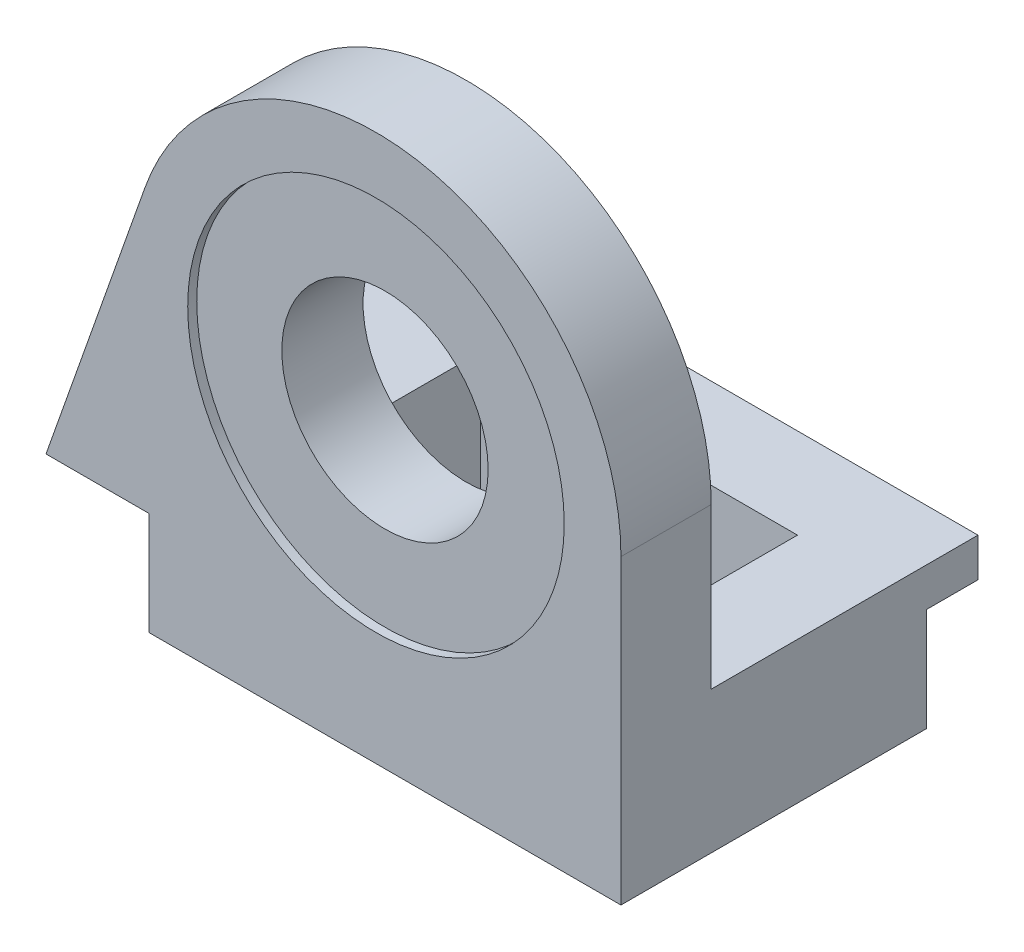
ISO-10303-21;
HEADER;
FILE_DESCRIPTION(('STEP AP214'),'2;1');
FILE_NAME('part.step','',(''),(''),'','','');
FILE_SCHEMA(('AUTOMOTIVE_DESIGN { 1 0 10303 214 1 1 1 1 }'));
ENDSEC;
DATA;
#1=APPLICATION_CONTEXT('core data for automotive mechanical design processes');
#2=APPLICATION_PROTOCOL_DEFINITION('international standard','automotive_design',2000,#1);
#3=PRODUCT_CONTEXT('',#1,'mechanical');
#4=PRODUCT('Part','Part','',(#3));
#5=PRODUCT_RELATED_PRODUCT_CATEGORY('part','',(#4));
#6=PRODUCT_DEFINITION_FORMATION('','',#4);
#7=PRODUCT_DEFINITION_CONTEXT('part definition',#1,'design');
#8=PRODUCT_DEFINITION('design','',#6,#7);
#9=PRODUCT_DEFINITION_SHAPE('','',#8);
#10=(LENGTH_UNIT() NAMED_UNIT(*) SI_UNIT(.MILLI.,.METRE.));
#11=(NAMED_UNIT(*) PLANE_ANGLE_UNIT() SI_UNIT($,.RADIAN.));
#12=(NAMED_UNIT(*) SI_UNIT($,.STERADIAN.) SOLID_ANGLE_UNIT());
#13=UNCERTAINTY_MEASURE_WITH_UNIT(LENGTH_MEASURE(1.E-05),#10,'distance_accuracy_value','');
#14=(GEOMETRIC_REPRESENTATION_CONTEXT(3) GLOBAL_UNCERTAINTY_ASSIGNED_CONTEXT((#13)) GLOBAL_UNIT_ASSIGNED_CONTEXT((#10,
#11,#12)) REPRESENTATION_CONTEXT('',''));
#15=CARTESIAN_POINT('',(0.,0.,0.));
#16=DIRECTION('',(0.,0.,1.));
#17=DIRECTION('',(1.,0.,0.));
#18=AXIS2_PLACEMENT_3D('',#15,#16,#17);
#19=CARTESIAN_POINT('',(0.,0.,-83.45));
#20=DIRECTION('',(0.,0.,1.));
#21=DIRECTION('',(1.,0.,0.));
#22=AXIS2_PLACEMENT_3D('',#19,#20,#21);
#23=PLANE('',#22);
#24=DIRECTION('',(-1.,0.,0.));
#25=VECTOR('',#24,1.);
#26=CARTESIAN_POINT('',(-127.95,-77.,-83.45));
#27=LINE('',#26,#25);
#28=CARTESIAN_POINT('',(95.,-77.,-83.45));
#29=VERTEX_POINT('',#28);
#30=CARTESIAN_POINT('',(-87.95,-77.,-83.45));
#31=VERTEX_POINT('',#30);
#32=EDGE_CURVE('E64',#29,#31,#27,.T.);
#33=ORIENTED_EDGE('',*,*,#32,.F.);
#34=DIRECTION('',(0.,-1.,0.));
#35=VECTOR('',#34,1.);
#36=CARTESIAN_POINT('',(95.,-117.,-83.45));
#37=LINE('',#36,#35);
#38=CARTESIAN_POINT('',(95.,-117.,-83.45));
#39=VERTEX_POINT('',#38);
#40=EDGE_CURVE('E260',#29,#39,#37,.T.);
#41=ORIENTED_EDGE('',*,*,#40,.T.);
#42=DIRECTION('',(-1.,0.,0.));
#43=VECTOR('',#42,1.);
#44=CARTESIAN_POINT('',(-87.95,-117.,-83.45));
#45=LINE('',#44,#43);
#46=CARTESIAN_POINT('',(-87.95,-117.,-83.45));
#47=VERTEX_POINT('',#46);
#48=EDGE_CURVE('E183',#39,#47,#45,.T.);
#49=ORIENTED_EDGE('',*,*,#48,.T.);
#50=DIRECTION('',(0.,1.,0.));
#51=VECTOR('',#50,1.);
#52=CARTESIAN_POINT('',(-87.95,-117.,-83.45));
#53=LINE('',#52,#51);
#54=EDGE_CURVE('E273',#47,#31,#53,.T.);
#55=ORIENTED_EDGE('',*,*,#54,.T.);
#56=EDGE_LOOP('',(#33,#41,#49,#55));
#57=FACE_BOUND('',#56,.T.);
#58=ADVANCED_FACE('F45',(#57),#23,.F.);
#59=CARTESIAN_POINT('',(0.,0.,0.));
#60=DIRECTION('',(0.,0.,1.));
#61=DIRECTION('',(1.,0.,0.));
#62=AXIS2_PLACEMENT_3D('',#59,#60,#61);
#63=PLANE('',#62);
#64=CARTESIAN_POINT('',(0.,0.,0.));
#65=DIRECTION('',(0.,0.,1.));
#66=DIRECTION('',(1.,0.,0.));
#67=AXIS2_PLACEMENT_3D('',#64,#65,#66);
#68=CIRCLE('',#67,40.);
#69=CARTESIAN_POINT('',(40.,0.,0.));
#70=VERTEX_POINT('',#69);
#71=EDGE_CURVE('E356',#70,#70,#68,.F.);
#72=ORIENTED_EDGE('',*,*,#71,.F.);
#73=EDGE_LOOP('',(#72));
#74=FACE_BOUND('',#73,.T.);
#75=DIRECTION('',(0.,1.,0.));
#76=VECTOR('',#75,1.);
#77=CARTESIAN_POINT('',(60.,-117.,0.));
#78=LINE('',#77,#76);
#79=CARTESIAN_POINT('',(60.,-117.,0.));
#80=VERTEX_POINT('',#79);
#81=CARTESIAN_POINT('',(60.,-62.,0.));
#82=VERTEX_POINT('',#81);
#83=EDGE_CURVE('E284',#80,#82,#78,.T.);
#84=ORIENTED_EDGE('',*,*,#83,.F.);
#85=DIRECTION('',(1.,0.,0.));
#86=VECTOR('',#85,1.);
#87=CARTESIAN_POINT('',(0.,-117.,0.));
#88=LINE('',#87,#86);
#89=CARTESIAN_POINT('',(-62.95,-117.,0.));
#90=VERTEX_POINT('',#89);
#91=EDGE_CURVE('E192',#90,#80,#88,.T.);
#92=ORIENTED_EDGE('',*,*,#91,.F.);
#93=DIRECTION('',(0.,-1.,0.));
#94=VECTOR('',#93,1.);
#95=CARTESIAN_POINT('',(-62.95,-117.,0.));
#96=LINE('',#95,#94);
#97=CARTESIAN_POINT('',(-62.95,-62.,0.));
#98=VERTEX_POINT('',#97);
#99=EDGE_CURVE('E276',#98,#90,#96,.T.);
#100=ORIENTED_EDGE('',*,*,#99,.F.);
#101=DIRECTION('',(1.,0.,0.));
#102=VECTOR('',#101,1.);
#103=CARTESIAN_POINT('',(-88.9771036518407,-62.,0.));
#104=LINE('',#103,#102);
#105=CARTESIAN_POINT('',(-122.651714273093,-62.,0.));
#106=VERTEX_POINT('',#105);
#107=EDGE_CURVE('E75',#106,#98,#104,.T.);
#108=ORIENTED_EDGE('',*,*,#107,.F.);
#109=DIRECTION('',(0.333053092923635,0.942908074678545,0.));
#110=VECTOR('',#109,1.);
#111=CARTESIAN_POINT('',(-89.5762670944617,31.6400438277453,0.));
#112=LINE('',#111,#110);
#113=CARTESIAN_POINT('',(-89.5762670944617,31.6400438277453,0.));
#114=VERTEX_POINT('',#113);
#115=EDGE_CURVE('E218',#106,#114,#112,.T.);
#116=ORIENTED_EDGE('',*,*,#115,.T.);
#117=CARTESIAN_POINT('',(0.,0.,0.));
#118=DIRECTION('',(0.,0.,1.));
#119=DIRECTION('',(1.,0.,0.));
#120=AXIS2_PLACEMENT_3D('',#117,#118,#119);
#121=CIRCLE('',#120,95.);
#122=CARTESIAN_POINT('',(95.,0.,0.));
#123=VERTEX_POINT('',#122);
#124=EDGE_CURVE('E214',#123,#114,#121,.T.);
#125=ORIENTED_EDGE('',*,*,#124,.F.);
#126=DIRECTION('',(0.,-1.,0.));
#127=VECTOR('',#126,1.);
#128=CARTESIAN_POINT('',(95.,0.,0.));
#129=LINE('',#128,#127);
#130=CARTESIAN_POINT('',(95.,-62.,0.));
#131=VERTEX_POINT('',#130);
#132=EDGE_CURVE('E181',#123,#131,#129,.T.);
#133=ORIENTED_EDGE('',*,*,#132,.T.);
#134=DIRECTION('',(1.,0.,0.));
#135=VECTOR('',#134,1.);
#136=CARTESIAN_POINT('',(95.,-62.,0.));
#137=LINE('',#136,#135);
#138=EDGE_CURVE('E266',#82,#131,#137,.T.);
#139=ORIENTED_EDGE('',*,*,#138,.F.);
#140=EDGE_LOOP('',(#84,#92,#100,#108,#116,#125,#133,#139));
#141=FACE_BOUND('',#140,.T.);
#142=ADVANCED_FACE('F248',(#74,#141),#63,.F.);
#143=CARTESIAN_POINT('',(95.,0.,35.));
#144=DIRECTION('',(1.,0.,0.));
#145=DIRECTION('',(0.,0.,-1.));
#146=AXIS2_PLACEMENT_3D('',#143,#144,#145);
#147=PLANE('',#146);
#148=ORIENTED_EDGE('',*,*,#132,.F.);
#149=DIRECTION('',(0.,0.,-1.));
#150=VECTOR('',#149,1.);
#151=CARTESIAN_POINT('',(95.,0.,35.));
#152=LINE('',#151,#150);
#153=CARTESIAN_POINT('',(95.,0.,35.));
#154=VERTEX_POINT('',#153);
#155=EDGE_CURVE('E11',#154,#123,#152,.T.);
#156=ORIENTED_EDGE('',*,*,#155,.F.);
#157=DIRECTION('',(0.,-1.,0.));
#158=VECTOR('',#157,1.);
#159=CARTESIAN_POINT('',(95.,0.,35.));
#160=LINE('',#159,#158);
#161=CARTESIAN_POINT('',(95.,-117.,35.));
#162=VERTEX_POINT('',#161);
#163=EDGE_CURVE('E187',#154,#162,#160,.T.);
#164=ORIENTED_EDGE('',*,*,#163,.T.);
#165=DIRECTION('',(0.,0.,-1.));
#166=VECTOR('',#165,1.);
#167=CARTESIAN_POINT('',(95.,-117.,35.));
#168=LINE('',#167,#166);
#169=EDGE_CURVE('E210',#162,#39,#168,.T.);
#170=ORIENTED_EDGE('',*,*,#169,.T.);
#171=ORIENTED_EDGE('',*,*,#40,.F.);
#172=DIRECTION('',(0.,0.,1.));
#173=VECTOR('',#172,1.);
#174=CARTESIAN_POINT('',(95.,-77.,-103.45));
#175=LINE('',#174,#173);
#176=CARTESIAN_POINT('',(95.,-77.,-103.45));
#177=VERTEX_POINT('',#176);
#178=EDGE_CURVE('E309',#177,#29,#175,.T.);
#179=ORIENTED_EDGE('',*,*,#178,.F.);
#180=DIRECTION('',(0.,-1.,0.));
#181=VECTOR('',#180,1.);
#182=CARTESIAN_POINT('',(95.,-77.,-103.45));
#183=LINE('',#182,#181);
#184=CARTESIAN_POINT('',(95.,-62.,-103.45));
#185=VERTEX_POINT('',#184);
#186=EDGE_CURVE('E255',#185,#177,#183,.T.);
#187=ORIENTED_EDGE('',*,*,#186,.F.);
#188=DIRECTION('',(0.,0.,1.));
#189=VECTOR('',#188,1.);
#190=CARTESIAN_POINT('',(95.,-62.,-83.45));
#191=LINE('',#190,#189);
#192=EDGE_CURVE('E253',#185,#131,#191,.T.);
#193=ORIENTED_EDGE('',*,*,#192,.T.);
#194=EDGE_LOOP('',(#148,#156,#164,#170,#171,#179,#187,#193));
#195=FACE_BOUND('',#194,.T.);
#196=ADVANCED_FACE('F47',(#195),#147,.T.);
#197=CARTESIAN_POINT('',(0.,0.,35.));
#198=DIRECTION('',(0.,0.,-1.));
#199=DIRECTION('',(-1.,0.,0.));
#200=AXIS2_PLACEMENT_3D('',#197,#198,#199);
#201=CYLINDRICAL_SURFACE('',#200,95.);
#202=ORIENTED_EDGE('',*,*,#124,.T.);
#203=DIRECTION('',(0.,0.,-1.));
#204=VECTOR('',#203,1.);
#205=CARTESIAN_POINT('',(-89.5762670944617,31.6400438277453,35.));
#206=LINE('',#205,#204);
#207=CARTESIAN_POINT('',(-89.5762670944617,31.6400438277453,35.));
#208=VERTEX_POINT('',#207);
#209=EDGE_CURVE('E54',#208,#114,#206,.T.);
#210=ORIENTED_EDGE('',*,*,#209,.F.);
#211=CARTESIAN_POINT('',(0.,0.,35.));
#212=DIRECTION('',(0.,0.,1.));
#213=DIRECTION('',(1.,0.,0.));
#214=AXIS2_PLACEMENT_3D('',#211,#212,#213);
#215=CIRCLE('',#214,95.);
#216=EDGE_CURVE('E191',#154,#208,#215,.T.);
#217=ORIENTED_EDGE('',*,*,#216,.F.);
#218=ORIENTED_EDGE('',*,*,#155,.T.);
#219=EDGE_LOOP('',(#202,#210,#217,#218));
#220=FACE_BOUND('',#219,.T.);
#221=ADVANCED_FACE('F245',(#220),#201,.T.);
#222=CARTESIAN_POINT('',(-89.5762670944617,31.6400438277453,35.));
#223=DIRECTION('',(-0.942908074678545,0.333053092923635,0.));
#224=DIRECTION('',(-0.333053092923635,-0.942908074678545,0.));
#225=AXIS2_PLACEMENT_3D('',#222,#223,#224);
#226=PLANE('',#225);
#227=ORIENTED_EDGE('',*,*,#115,.F.);
#228=DIRECTION('',(0.,0.,1.));
#229=VECTOR('',#228,1.);
#230=CARTESIAN_POINT('',(-122.651714273093,-62.,-83.45));
#231=LINE('',#230,#229);
#232=CARTESIAN_POINT('',(-122.651714273093,-62.,-103.45));
#233=VERTEX_POINT('',#232);
#234=EDGE_CURVE('E177',#233,#106,#231,.T.);
#235=ORIENTED_EDGE('',*,*,#234,.F.);
#236=DIRECTION('',(0.333053092923635,0.942908074678545,0.));
#237=VECTOR('',#236,1.);
#238=CARTESIAN_POINT('',(-122.651714273093,-62.,-103.45));
#239=LINE('',#238,#237);
#240=CARTESIAN_POINT('',(-127.95,-77.,-103.45));
#241=VERTEX_POINT('',#240);
#242=EDGE_CURVE('E294',#241,#233,#239,.T.);
#243=ORIENTED_EDGE('',*,*,#242,.F.);
#244=DIRECTION('',(0.,0.,-1.));
#245=VECTOR('',#244,1.);
#246=CARTESIAN_POINT('',(-127.95,-77.,35.));
#247=LINE('',#246,#245);
#248=CARTESIAN_POINT('',(-127.95,-77.,35.));
#249=VERTEX_POINT('',#248);
#250=EDGE_CURVE('E234',#249,#241,#247,.T.);
#251=ORIENTED_EDGE('',*,*,#250,.F.);
#252=DIRECTION('',(0.333053092923635,0.942908074678545,0.));
#253=VECTOR('',#252,1.);
#254=CARTESIAN_POINT('',(-89.5762670944617,31.6400438277453,35.));
#255=LINE('',#254,#253);
#256=EDGE_CURVE('E195',#249,#208,#255,.T.);
#257=ORIENTED_EDGE('',*,*,#256,.T.);
#258=ORIENTED_EDGE('',*,*,#209,.T.);
#259=EDGE_LOOP('',(#227,#235,#243,#251,#257,#258));
#260=FACE_BOUND('',#259,.T.);
#261=ADVANCED_FACE('F240',(#260),#226,.T.);
#262=CARTESIAN_POINT('',(0.,-77.,35.));
#263=DIRECTION('',(0.,-1.,0.));
#264=DIRECTION('',(0.,0.,-1.));
#265=AXIS2_PLACEMENT_3D('',#262,#263,#264);
#266=PLANE('',#265);
#267=ORIENTED_EDGE('',*,*,#250,.T.);
#268=DIRECTION('',(-1.,0.,0.));
#269=VECTOR('',#268,1.);
#270=CARTESIAN_POINT('',(-127.95,-77.,-103.45));
#271=LINE('',#270,#269);
#272=EDGE_CURVE('E306',#177,#241,#271,.T.);
#273=ORIENTED_EDGE('',*,*,#272,.F.);
#274=ORIENTED_EDGE('',*,*,#178,.T.);
#275=ORIENTED_EDGE('',*,*,#32,.T.);
#276=DIRECTION('',(0.,0.,-1.));
#277=VECTOR('',#276,1.);
#278=CARTESIAN_POINT('',(-87.95,-77.,35.));
#279=LINE('',#278,#277);
#280=CARTESIAN_POINT('',(-87.95,-77.,35.));
#281=VERTEX_POINT('',#280);
#282=EDGE_CURVE('E230',#281,#31,#279,.T.);
#283=ORIENTED_EDGE('',*,*,#282,.F.);
#284=DIRECTION('',(-1.,0.,0.));
#285=VECTOR('',#284,1.);
#286=CARTESIAN_POINT('',(0.,-77.,35.));
#287=LINE('',#286,#285);
#288=EDGE_CURVE('E199',#281,#249,#287,.T.);
#289=ORIENTED_EDGE('',*,*,#288,.T.);
#290=EDGE_LOOP('',(#267,#273,#274,#275,#283,#289));
#291=FACE_BOUND('',#290,.T.);
#292=ADVANCED_FACE('F386',(#291),#266,.T.);
#293=CARTESIAN_POINT('',(-87.95,0.,35.));
#294=DIRECTION('',(-1.,0.,0.));
#295=DIRECTION('',(0.,0.,1.));
#296=AXIS2_PLACEMENT_3D('',#293,#294,#295);
#297=PLANE('',#296);
#298=ORIENTED_EDGE('',*,*,#282,.T.);
#299=ORIENTED_EDGE('',*,*,#54,.F.);
#300=DIRECTION('',(0.,0.,-1.));
#301=VECTOR('',#300,1.);
#302=CARTESIAN_POINT('',(-87.95,-117.,35.));
#303=LINE('',#302,#301);
#304=CARTESIAN_POINT('',(-87.95,-117.,35.));
#305=VERTEX_POINT('',#304);
#306=EDGE_CURVE('E227',#305,#47,#303,.T.);
#307=ORIENTED_EDGE('',*,*,#306,.F.);
#308=DIRECTION('',(0.,1.,0.));
#309=VECTOR('',#308,1.);
#310=CARTESIAN_POINT('',(-87.95,0.,35.));
#311=LINE('',#310,#309);
#312=EDGE_CURVE('E203',#305,#281,#311,.T.);
#313=ORIENTED_EDGE('',*,*,#312,.T.);
#314=EDGE_LOOP('',(#298,#299,#307,#313));
#315=FACE_BOUND('',#314,.T.);
#316=ADVANCED_FACE('F383',(#315),#297,.T.);
#317=CARTESIAN_POINT('',(0.,-117.,35.));
#318=DIRECTION('',(0.,1.,0.));
#319=DIRECTION('',(-1.,0.,0.));
#320=AXIS2_PLACEMENT_3D('',#317,#318,#319);
#321=PLANE('',#320);
#322=DIRECTION('',(-1.,0.,0.));
#323=VECTOR('',#322,1.);
#324=CARTESIAN_POINT('',(-62.95,-117.,-68.45));
#325=LINE('',#324,#323);
#326=CARTESIAN_POINT('',(60.,-117.,-68.45));
#327=VERTEX_POINT('',#326);
#328=CARTESIAN_POINT('',(-62.95,-117.,-68.45));
#329=VERTEX_POINT('',#328);
#330=EDGE_CURVE('E289',#327,#329,#325,.T.);
#331=ORIENTED_EDGE('',*,*,#330,.T.);
#332=DIRECTION('',(0.,0.,1.));
#333=VECTOR('',#332,1.);
#334=CARTESIAN_POINT('',(-62.95,-117.,-83.45));
#335=LINE('',#334,#333);
#336=EDGE_CURVE('E171',#329,#90,#335,.T.);
#337=ORIENTED_EDGE('',*,*,#336,.T.);
#338=ORIENTED_EDGE('',*,*,#91,.T.);
#339=DIRECTION('',(0.,0.,1.));
#340=VECTOR('',#339,1.);
#341=CARTESIAN_POINT('',(60.,-117.,-83.45));
#342=LINE('',#341,#340);
#343=EDGE_CURVE('E264',#327,#80,#342,.T.);
#344=ORIENTED_EDGE('',*,*,#343,.F.);
#345=EDGE_LOOP('',(#331,#337,#338,#344));
#346=FACE_BOUND('',#345,.T.);
#347=ORIENTED_EDGE('',*,*,#306,.T.);
#348=ORIENTED_EDGE('',*,*,#48,.F.);
#349=ORIENTED_EDGE('',*,*,#169,.F.);
#350=DIRECTION('',(1.,0.,0.));
#351=VECTOR('',#350,1.);
#352=CARTESIAN_POINT('',(0.,-117.,35.));
#353=LINE('',#352,#351);
#354=EDGE_CURVE('E207',#305,#162,#353,.T.);
#355=ORIENTED_EDGE('',*,*,#354,.F.);
#356=EDGE_LOOP('',(#347,#348,#349,#355));
#357=FACE_BOUND('',#356,.T.);
#358=ADVANCED_FACE('F287',(#346,#357),#321,.F.);
#359=CARTESIAN_POINT('',(0.,0.,35.));
#360=DIRECTION('',(0.,0.,1.));
#361=DIRECTION('',(1.,0.,0.));
#362=AXIS2_PLACEMENT_3D('',#359,#360,#361);
#363=PLANE('',#362);
#364=CARTESIAN_POINT('',(0.,0.,35.));
#365=DIRECTION('',(0.,0.,1.));
#366=DIRECTION('',(1.,0.,0.));
#367=AXIS2_PLACEMENT_3D('',#364,#365,#366);
#368=CIRCLE('',#367,73.);
#369=CARTESIAN_POINT('',(73.,0.,35.));
#370=VERTEX_POINT('',#369);
#371=EDGE_CURVE('E358',#370,#370,#368,.T.);
#372=ORIENTED_EDGE('',*,*,#371,.F.);
#373=EDGE_LOOP('',(#372));
#374=FACE_BOUND('',#373,.T.);
#375=ORIENTED_EDGE('',*,*,#163,.F.);
#376=ORIENTED_EDGE('',*,*,#216,.T.);
#377=ORIENTED_EDGE('',*,*,#256,.F.);
#378=ORIENTED_EDGE('',*,*,#288,.F.);
#379=ORIENTED_EDGE('',*,*,#312,.F.);
#380=ORIENTED_EDGE('',*,*,#354,.T.);
#381=EDGE_LOOP('',(#375,#376,#377,#378,#379,#380));
#382=FACE_BOUND('',#381,.T.);
#383=ADVANCED_FACE('F373',(#374,#382),#363,.T.);
#384=CARTESIAN_POINT('',(-88.9771036518407,-62.,-83.45));
#385=DIRECTION('',(0.,-1.,0.));
#386=DIRECTION('',(0.,0.,-1.));
#387=AXIS2_PLACEMENT_3D('',#384,#385,#386);
#388=PLANE('',#387);
#389=DIRECTION('',(0.,0.,1.));
#390=VECTOR('',#389,1.);
#391=CARTESIAN_POINT('',(-62.95,-62.,-83.45));
#392=LINE('',#391,#390);
#393=CARTESIAN_POINT('',(-62.95,-62.,-68.45));
#394=VERTEX_POINT('',#393);
#395=EDGE_CURVE('E170',#394,#98,#392,.T.);
#396=ORIENTED_EDGE('',*,*,#395,.F.);
#397=DIRECTION('',(1.,0.,0.));
#398=VECTOR('',#397,1.);
#399=CARTESIAN_POINT('',(-62.95,-62.,-68.45));
#400=LINE('',#399,#398);
#401=CARTESIAN_POINT('',(60.,-62.,-68.45));
#402=VERTEX_POINT('',#401);
#403=EDGE_CURVE('E154',#394,#402,#400,.T.);
#404=ORIENTED_EDGE('',*,*,#403,.T.);
#405=DIRECTION('',(0.,0.,1.));
#406=VECTOR('',#405,1.);
#407=CARTESIAN_POINT('',(60.,-62.,-83.45));
#408=LINE('',#407,#406);
#409=EDGE_CURVE('E259',#402,#82,#408,.T.);
#410=ORIENTED_EDGE('',*,*,#409,.T.);
#411=ORIENTED_EDGE('',*,*,#138,.T.);
#412=ORIENTED_EDGE('',*,*,#192,.F.);
#413=DIRECTION('',(1.,0.,0.));
#414=VECTOR('',#413,1.);
#415=CARTESIAN_POINT('',(95.,-62.,-103.45));
#416=LINE('',#415,#414);
#417=EDGE_CURVE('E301',#233,#185,#416,.T.);
#418=ORIENTED_EDGE('',*,*,#417,.F.);
#419=ORIENTED_EDGE('',*,*,#234,.T.);
#420=ORIENTED_EDGE('',*,*,#107,.T.);
#421=EDGE_LOOP('',(#396,#404,#410,#411,#412,#418,#419,#420));
#422=FACE_BOUND('',#421,.T.);
#423=ADVANCED_FACE('F174',(#422),#388,.F.);
#424=CARTESIAN_POINT('',(-62.95,-117.,-83.45));
#425=DIRECTION('',(-1.,0.,0.));
#426=DIRECTION('',(0.,0.,1.));
#427=AXIS2_PLACEMENT_3D('',#424,#425,#426);
#428=PLANE('',#427);
#429=ORIENTED_EDGE('',*,*,#336,.F.);
#430=DIRECTION('',(0.,1.,0.));
#431=VECTOR('',#430,1.);
#432=CARTESIAN_POINT('',(-62.95,-240.861626422391,-68.45));
#433=LINE('',#432,#431);
#434=EDGE_CURVE('E157',#329,#394,#433,.T.);
#435=ORIENTED_EDGE('',*,*,#434,.T.);
#436=ORIENTED_EDGE('',*,*,#395,.T.);
#437=ORIENTED_EDGE('',*,*,#99,.T.);
#438=EDGE_LOOP('',(#429,#435,#436,#437));
#439=FACE_BOUND('',#438,.T.);
#440=ADVANCED_FACE('F168',(#439),#428,.F.);
#441=CARTESIAN_POINT('',(60.,-117.,-83.45));
#442=DIRECTION('',(1.,0.,0.));
#443=DIRECTION('',(0.,0.,-1.));
#444=AXIS2_PLACEMENT_3D('',#441,#442,#443);
#445=PLANE('',#444);
#446=ORIENTED_EDGE('',*,*,#409,.F.);
#447=DIRECTION('',(0.,1.,0.));
#448=VECTOR('',#447,1.);
#449=CARTESIAN_POINT('',(60.,-240.861626422391,-68.45));
#450=LINE('',#449,#448);
#451=EDGE_CURVE('E160',#327,#402,#450,.T.);
#452=ORIENTED_EDGE('',*,*,#451,.F.);
#453=ORIENTED_EDGE('',*,*,#343,.T.);
#454=ORIENTED_EDGE('',*,*,#83,.T.);
#455=EDGE_LOOP('',(#446,#452,#453,#454));
#456=FACE_BOUND('',#455,.T.);
#457=ADVANCED_FACE('F316',(#456),#445,.F.);
#458=CARTESIAN_POINT('',(0.,0.,-103.45));
#459=DIRECTION('',(0.,0.,1.));
#460=DIRECTION('',(1.,0.,0.));
#461=AXIS2_PLACEMENT_3D('',#458,#459,#460);
#462=PLANE('',#461);
#463=ORIENTED_EDGE('',*,*,#242,.T.);
#464=ORIENTED_EDGE('',*,*,#417,.T.);
#465=ORIENTED_EDGE('',*,*,#186,.T.);
#466=ORIENTED_EDGE('',*,*,#272,.T.);
#467=EDGE_LOOP('',(#463,#464,#465,#466));
#468=FACE_BOUND('',#467,.T.);
#469=ADVANCED_FACE('F318',(#468),#462,.F.);
#470=CARTESIAN_POINT('',(-62.95,-240.861626422391,-68.45));
#471=DIRECTION('',(0.,0.,1.));
#472=DIRECTION('',(1.,0.,0.));
#473=AXIS2_PLACEMENT_3D('',#470,#471,#472);
#474=PLANE('',#473);
#475=ORIENTED_EDGE('',*,*,#330,.F.);
#476=ORIENTED_EDGE('',*,*,#451,.T.);
#477=ORIENTED_EDGE('',*,*,#403,.F.);
#478=ORIENTED_EDGE('',*,*,#434,.F.);
#479=EDGE_LOOP('',(#475,#476,#477,#478));
#480=FACE_BOUND('',#479,.T.);
#481=ADVANCED_FACE('F156',(#480),#474,.T.);
#482=CARTESIAN_POINT('',(0.,0.,31.5));
#483=DIRECTION('',(0.,0.,1.));
#484=DIRECTION('',(1.,0.,0.));
#485=AXIS2_PLACEMENT_3D('',#482,#483,#484);
#486=CYLINDRICAL_SURFACE('',#485,73.);
#487=CARTESIAN_POINT('',(0.,0.,31.5));
#488=DIRECTION('',(0.,0.,1.));
#489=DIRECTION('',(1.,0.,0.));
#490=AXIS2_PLACEMENT_3D('',#487,#488,#489);
#491=CIRCLE('',#490,73.);
#492=CARTESIAN_POINT('',(73.,0.,31.5));
#493=VERTEX_POINT('',#492);
#494=EDGE_CURVE('E165',#493,#493,#491,.T.);
#495=ORIENTED_EDGE('',*,*,#494,.F.);
#496=EDGE_LOOP('',(#495));
#497=FACE_BOUND('',#496,.T.);
#498=ORIENTED_EDGE('',*,*,#371,.T.);
#499=EDGE_LOOP('',(#498));
#500=FACE_BOUND('',#499,.T.);
#501=ADVANCED_FACE('F337',(#497,#500),#486,.F.);
#502=CARTESIAN_POINT('',(0.,0.,31.5));
#503=DIRECTION('',(0.,0.,1.));
#504=DIRECTION('',(1.,0.,0.));
#505=AXIS2_PLACEMENT_3D('',#502,#503,#504);
#506=PLANE('',#505);
#507=CARTESIAN_POINT('',(0.,0.,31.5));
#508=DIRECTION('',(0.,0.,1.));
#509=DIRECTION('',(1.,0.,0.));
#510=AXIS2_PLACEMENT_3D('',#507,#508,#509);
#511=CIRCLE('',#510,40.);
#512=CARTESIAN_POINT('',(40.,0.,31.5));
#513=VERTEX_POINT('',#512);
#514=EDGE_CURVE('E353',#513,#513,#511,.T.);
#515=ORIENTED_EDGE('',*,*,#514,.F.);
#516=EDGE_LOOP('',(#515));
#517=FACE_BOUND('',#516,.T.);
#518=ORIENTED_EDGE('',*,*,#494,.T.);
#519=EDGE_LOOP('',(#518));
#520=FACE_BOUND('',#519,.T.);
#521=ADVANCED_FACE('F340',(#517,#520),#506,.T.);
#522=CARTESIAN_POINT('',(0.,0.,-103.451));
#523=DIRECTION('',(0.,0.,1.));
#524=DIRECTION('',(1.,0.,0.));
#525=AXIS2_PLACEMENT_3D('',#522,#523,#524);
#526=CYLINDRICAL_SURFACE('',#525,40.);
#527=ORIENTED_EDGE('',*,*,#514,.T.);
#528=EDGE_LOOP('',(#527));
#529=FACE_BOUND('',#528,.T.);
#530=ORIENTED_EDGE('',*,*,#71,.T.);
#531=EDGE_LOOP('',(#530));
#532=FACE_BOUND('',#531,.T.);
#533=ADVANCED_FACE('F344',(#529,#532),#526,.F.);
#534=CLOSED_SHELL('',(#58,#142,#196,#221,#261,#292,#316,#358,#383,#423,#440,#457,#469,#481,#501,
#521,#533));
#535=MANIFOLD_SOLID_BREP('B2',#534);
#536=ADVANCED_BREP_SHAPE_REPRESENTATION('',(#18,#535),#14);
#537=SHAPE_DEFINITION_REPRESENTATION(#9,#536);
ENDSEC;
END-ISO-10303-21;
